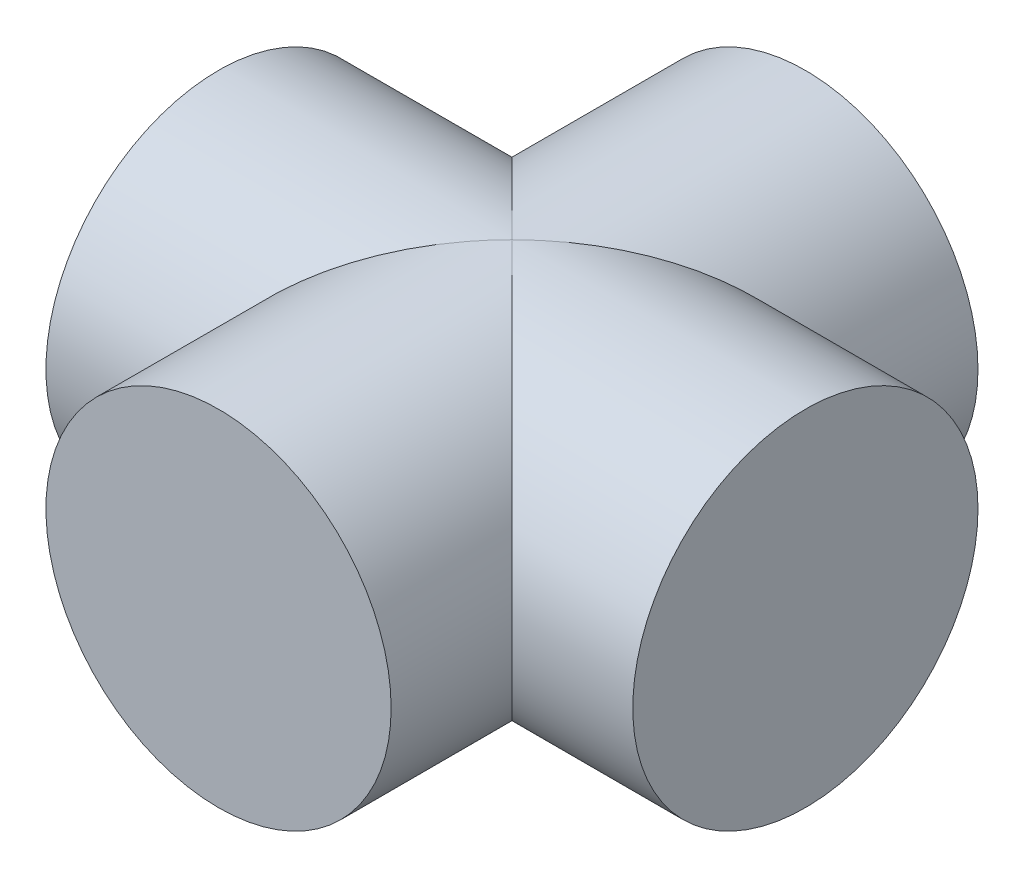
ISO-10303-21;
HEADER;
FILE_DESCRIPTION(('STEP AP214'),'2;1');
FILE_NAME('part.step','',(''),(''),'','','');
FILE_SCHEMA(('AUTOMOTIVE_DESIGN { 1 0 10303 214 1 1 1 1 }'));
ENDSEC;
DATA;
#1=APPLICATION_CONTEXT('core data for automotive mechanical design processes');
#2=APPLICATION_PROTOCOL_DEFINITION('international standard','automotive_design',2000,#1);
#3=PRODUCT_CONTEXT('',#1,'mechanical');
#4=PRODUCT('Part','Part','',(#3));
#5=PRODUCT_RELATED_PRODUCT_CATEGORY('part','',(#4));
#6=PRODUCT_DEFINITION_FORMATION('','',#4);
#7=PRODUCT_DEFINITION_CONTEXT('part definition',#1,'design');
#8=PRODUCT_DEFINITION('design','',#6,#7);
#9=PRODUCT_DEFINITION_SHAPE('','',#8);
#10=(LENGTH_UNIT() NAMED_UNIT(*) SI_UNIT(.MILLI.,.METRE.));
#11=(NAMED_UNIT(*) PLANE_ANGLE_UNIT() SI_UNIT($,.RADIAN.));
#12=(NAMED_UNIT(*) SI_UNIT($,.STERADIAN.) SOLID_ANGLE_UNIT());
#13=UNCERTAINTY_MEASURE_WITH_UNIT(LENGTH_MEASURE(1.E-05),#10,'distance_accuracy_value','');
#14=(GEOMETRIC_REPRESENTATION_CONTEXT(3) GLOBAL_UNCERTAINTY_ASSIGNED_CONTEXT((#13)) GLOBAL_UNIT_ASSIGNED_CONTEXT((#10,
#11,#12)) REPRESENTATION_CONTEXT('',''));
#15=CARTESIAN_POINT('',(0.,0.,0.));
#16=DIRECTION('',(0.,0.,1.));
#17=DIRECTION('',(1.,0.,0.));
#18=AXIS2_PLACEMENT_3D('',#15,#16,#17);
#19=CARTESIAN_POINT('',(0.,0.,25.5));
#20=DIRECTION('',(0.,0.,-1.));
#21=DIRECTION('',(-1.,0.,0.));
#22=AXIS2_PLACEMENT_3D('',#19,#20,#21);
#23=CYLINDRICAL_SURFACE('',#22,7.50000000000001);
#24=CARTESIAN_POINT('',(0.,0.,12.75));
#25=DIRECTION('',(-0.707106781186547,0.,-0.707106781186547));
#26=DIRECTION('',(0.707106781186547,0.,-0.707106781186547));
#27=AXIS2_PLACEMENT_3D('',#24,#25,#26);
#28=ELLIPSE('',#27,10.6066017177982,7.5);
#29=CARTESIAN_POINT('',(0.,7.5,12.75));
#30=VERTEX_POINT('',#29);
#31=CARTESIAN_POINT('',(0.,-7.5,12.75));
#32=VERTEX_POINT('',#31);
#33=EDGE_CURVE('E51',#30,#32,#28,.T.);
#34=ORIENTED_EDGE('',*,*,#33,.T.);
#35=CARTESIAN_POINT('',(0.,0.,12.75));
#36=DIRECTION('',(0.707106781186547,0.,-0.707106781186547));
#37=DIRECTION('',(-0.707106781186547,0.,-0.707106781186547));
#38=AXIS2_PLACEMENT_3D('',#35,#36,#37);
#39=ELLIPSE('',#38,10.6066017177982,7.5);
#40=EDGE_CURVE('E40',#32,#30,#39,.T.);
#41=ORIENTED_EDGE('',*,*,#40,.T.);
#42=EDGE_LOOP('',(#34,#41));
#43=FACE_BOUND('',#42,.T.);
#44=CARTESIAN_POINT('',(0.,0.,0.));
#45=DIRECTION('',(0.,0.,1.));
#46=DIRECTION('',(1.,0.,0.));
#47=AXIS2_PLACEMENT_3D('',#44,#45,#46);
#48=CIRCLE('',#47,7.50000000000001);
#49=CARTESIAN_POINT('',(7.50000000000001,0.,0.));
#50=VERTEX_POINT('',#49);
#51=EDGE_CURVE('E63',#50,#50,#48,.T.);
#52=ORIENTED_EDGE('',*,*,#51,.T.);
#53=EDGE_LOOP('',(#52));
#54=FACE_BOUND('',#53,.T.);
#55=ADVANCED_FACE('F33',(#43,#54),#23,.T.);
#56=CARTESIAN_POINT('',(0.,0.,0.));
#57=DIRECTION('',(0.,0.,1.));
#58=DIRECTION('',(1.,0.,0.));
#59=AXIS2_PLACEMENT_3D('',#56,#57,#58);
#60=PLANE('',#59);
#61=ORIENTED_EDGE('',*,*,#51,.F.);
#62=EDGE_LOOP('',(#61));
#63=FACE_BOUND('',#62,.T.);
#64=ADVANCED_FACE('F90',(#63),#60,.F.);
#65=CARTESIAN_POINT('',(-12.75,0.,12.75));
#66=DIRECTION('',(1.,0.,0.));
#67=DIRECTION('',(0.,0.,-1.));
#68=AXIS2_PLACEMENT_3D('',#65,#66,#67);
#69=PLANE('',#68);
#70=CARTESIAN_POINT('',(-12.75,0.,12.75));
#71=DIRECTION('',(1.,0.,0.));
#72=DIRECTION('',(0.,0.,-1.));
#73=AXIS2_PLACEMENT_3D('',#70,#71,#72);
#74=CIRCLE('',#73,7.5);
#75=CARTESIAN_POINT('',(-12.75,0.,5.25));
#76=VERTEX_POINT('',#75);
#77=EDGE_CURVE('E66',#76,#76,#74,.T.);
#78=ORIENTED_EDGE('',*,*,#77,.F.);
#79=EDGE_LOOP('',(#78));
#80=FACE_BOUND('',#79,.T.);
#81=ADVANCED_FACE('F85',(#80),#69,.F.);
#82=CARTESIAN_POINT('',(-12.75,0.,12.75));
#83=DIRECTION('',(1.,0.,0.));
#84=DIRECTION('',(0.,0.,-1.));
#85=AXIS2_PLACEMENT_3D('',#82,#83,#84);
#86=CYLINDRICAL_SURFACE('',#85,7.5);
#87=ORIENTED_EDGE('',*,*,#77,.T.);
#88=EDGE_LOOP('',(#87));
#89=FACE_BOUND('',#88,.T.);
#90=ORIENTED_EDGE('',*,*,#40,.F.);
#91=CARTESIAN_POINT('',(0.,0.,12.75));
#92=DIRECTION('',(-0.707106781186547,0.,-0.707106781186547));
#93=DIRECTION('',(0.707106781186547,0.,-0.707106781186547));
#94=AXIS2_PLACEMENT_3D('',#91,#92,#93);
#95=ELLIPSE('',#94,10.6066017177982,7.5);
#96=EDGE_CURVE('E45',#30,#32,#95,.F.);
#97=ORIENTED_EDGE('',*,*,#96,.F.);
#98=EDGE_LOOP('',(#90,#97));
#99=FACE_BOUND('',#98,.T.);
#100=ADVANCED_FACE('F57',(#89,#99),#86,.T.);
#101=CARTESIAN_POINT('',(12.75,0.,12.75));
#102=DIRECTION('',(1.,0.,0.));
#103=DIRECTION('',(0.,0.,-1.));
#104=AXIS2_PLACEMENT_3D('',#101,#102,#103);
#105=CIRCLE('',#104,7.5);
#106=CARTESIAN_POINT('',(12.75,0.,5.25));
#107=VERTEX_POINT('',#106);
#108=EDGE_CURVE('E71',#107,#107,#105,.T.);
#109=ORIENTED_EDGE('',*,*,#108,.F.);
#110=EDGE_LOOP('',(#109));
#111=FACE_BOUND('',#110,.T.);
#112=CARTESIAN_POINT('',(0.,0.,12.75));
#113=DIRECTION('',(0.707106781186547,0.,-0.707106781186547));
#114=DIRECTION('',(-0.707106781186547,0.,-0.707106781186547));
#115=AXIS2_PLACEMENT_3D('',#112,#113,#114);
#116=ELLIPSE('',#115,10.6066017177982,7.5);
#117=EDGE_CURVE('E11',#32,#30,#116,.F.);
#118=ORIENTED_EDGE('',*,*,#117,.F.);
#119=ORIENTED_EDGE('',*,*,#33,.F.);
#120=EDGE_LOOP('',(#118,#119));
#121=FACE_BOUND('',#120,.T.);
#122=ADVANCED_FACE('F52',(#111,#121),#86,.T.);
#123=CARTESIAN_POINT('',(12.75,0.,12.75));
#124=DIRECTION('',(1.,0.,0.));
#125=DIRECTION('',(0.,0.,-1.));
#126=AXIS2_PLACEMENT_3D('',#123,#124,#125);
#127=PLANE('',#126);
#128=ORIENTED_EDGE('',*,*,#108,.T.);
#129=EDGE_LOOP('',(#128));
#130=FACE_BOUND('',#129,.T.);
#131=ADVANCED_FACE('F75',(#130),#127,.T.);
#132=CARTESIAN_POINT('',(0.,0.,25.5));
#133=DIRECTION('',(0.,0.,1.));
#134=DIRECTION('',(1.,0.,0.));
#135=AXIS2_PLACEMENT_3D('',#132,#133,#134);
#136=PLANE('',#135);
#137=CARTESIAN_POINT('',(0.,0.,25.5));
#138=DIRECTION('',(0.,0.,1.));
#139=DIRECTION('',(1.,0.,0.));
#140=AXIS2_PLACEMENT_3D('',#137,#138,#139);
#141=CIRCLE('',#140,7.50000000000001);
#142=CARTESIAN_POINT('',(7.50000000000001,0.,25.5));
#143=VERTEX_POINT('',#142);
#144=EDGE_CURVE('E58',#143,#143,#141,.T.);
#145=ORIENTED_EDGE('',*,*,#144,.T.);
#146=EDGE_LOOP('',(#145));
#147=FACE_BOUND('',#146,.T.);
#148=ADVANCED_FACE('F83',(#147),#136,.T.);
#149=ORIENTED_EDGE('',*,*,#144,.F.);
#150=EDGE_LOOP('',(#149));
#151=FACE_BOUND('',#150,.T.);
#152=ORIENTED_EDGE('',*,*,#96,.T.);
#153=ORIENTED_EDGE('',*,*,#117,.T.);
#154=EDGE_LOOP('',(#152,#153));
#155=FACE_BOUND('',#154,.T.);
#156=ADVANCED_FACE('F60',(#151,#155),#23,.T.);
#157=CLOSED_SHELL('',(#55,#64,#81,#100,#122,#131,#148,#156));
#158=MANIFOLD_SOLID_BREP('B2',#157);
#159=ADVANCED_BREP_SHAPE_REPRESENTATION('',(#18,#158),#14);
#160=SHAPE_DEFINITION_REPRESENTATION(#9,#159);
ENDSEC;
END-ISO-10303-21;
